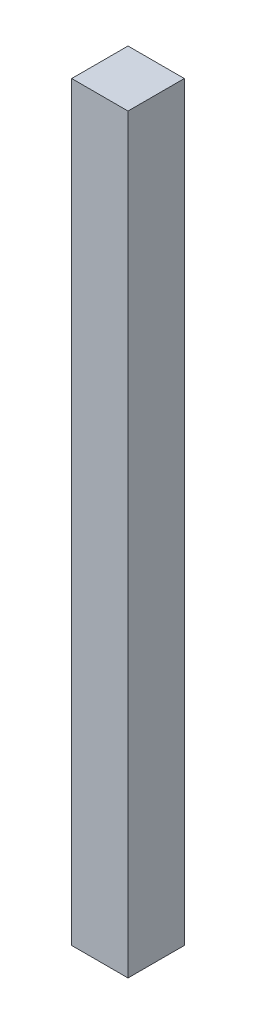
ISO-10303-21;
HEADER;
FILE_DESCRIPTION(('STEP AP214'),'2;1');
FILE_NAME('part.step','',(''),(''),'','','');
FILE_SCHEMA(('AUTOMOTIVE_DESIGN { 1 0 10303 214 1 1 1 1 }'));
ENDSEC;
DATA;
#1=APPLICATION_CONTEXT('core data for automotive mechanical design processes');
#2=APPLICATION_PROTOCOL_DEFINITION('international standard','automotive_design',2000,#1);
#3=PRODUCT_CONTEXT('',#1,'mechanical');
#4=PRODUCT('Part','Part','',(#3));
#5=PRODUCT_RELATED_PRODUCT_CATEGORY('part','',(#4));
#6=PRODUCT_DEFINITION_FORMATION('','',#4);
#7=PRODUCT_DEFINITION_CONTEXT('part definition',#1,'design');
#8=PRODUCT_DEFINITION('design','',#6,#7);
#9=PRODUCT_DEFINITION_SHAPE('','',#8);
#10=(LENGTH_UNIT() NAMED_UNIT(*) SI_UNIT(.MILLI.,.METRE.));
#11=(NAMED_UNIT(*) PLANE_ANGLE_UNIT() SI_UNIT($,.RADIAN.));
#12=(NAMED_UNIT(*) SI_UNIT($,.STERADIAN.) SOLID_ANGLE_UNIT());
#13=UNCERTAINTY_MEASURE_WITH_UNIT(LENGTH_MEASURE(1.E-05),#10,'distance_accuracy_value','');
#14=(GEOMETRIC_REPRESENTATION_CONTEXT(3) GLOBAL_UNCERTAINTY_ASSIGNED_CONTEXT((#13)) GLOBAL_UNIT_ASSIGNED_CONTEXT((#10,
#11,#12)) REPRESENTATION_CONTEXT('',''));
#15=CARTESIAN_POINT('',(0.,0.,0.));
#16=DIRECTION('',(0.,0.,1.));
#17=DIRECTION('',(1.,0.,0.));
#18=AXIS2_PLACEMENT_3D('',#15,#16,#17);
#19=CARTESIAN_POINT('',(-7.5,100.,7.5));
#20=DIRECTION('',(1.,0.,0.));
#21=DIRECTION('',(0.,0.,-1.));
#22=AXIS2_PLACEMENT_3D('',#19,#20,#21);
#23=PLANE('',#22);
#24=DIRECTION('',(0.,0.,1.));
#25=VECTOR('',#24,1.);
#26=CARTESIAN_POINT('',(-7.5,-100.,7.5));
#27=LINE('',#26,#25);
#28=CARTESIAN_POINT('',(-7.5,-100.,-7.5));
#29=VERTEX_POINT('',#28);
#30=CARTESIAN_POINT('',(-7.5,-100.,7.5));
#31=VERTEX_POINT('',#30);
#32=EDGE_CURVE('E96',#29,#31,#27,.T.);
#33=ORIENTED_EDGE('',*,*,#32,.T.);
#34=DIRECTION('',(0.,-1.,0.));
#35=VECTOR('',#34,1.);
#36=CARTESIAN_POINT('',(-7.5,100.,7.5));
#37=LINE('',#36,#35);
#38=CARTESIAN_POINT('',(-7.5,100.,7.5));
#39=VERTEX_POINT('',#38);
#40=EDGE_CURVE('E11',#39,#31,#37,.T.);
#41=ORIENTED_EDGE('',*,*,#40,.F.);
#42=DIRECTION('',(0.,0.,1.));
#43=VECTOR('',#42,1.);
#44=CARTESIAN_POINT('',(-7.5,100.,7.5));
#45=LINE('',#44,#43);
#46=CARTESIAN_POINT('',(-7.5,100.,-7.5));
#47=VERTEX_POINT('',#46);
#48=EDGE_CURVE('E84',#47,#39,#45,.T.);
#49=ORIENTED_EDGE('',*,*,#48,.F.);
#50=DIRECTION('',(0.,-1.,0.));
#51=VECTOR('',#50,1.);
#52=CARTESIAN_POINT('',(-7.5,100.,-7.5));
#53=LINE('',#52,#51);
#54=EDGE_CURVE('E92',#47,#29,#53,.T.);
#55=ORIENTED_EDGE('',*,*,#54,.T.);
#56=EDGE_LOOP('',(#33,#41,#49,#55));
#57=FACE_BOUND('',#56,.T.);
#58=ADVANCED_FACE('F33',(#57),#23,.F.);
#59=CARTESIAN_POINT('',(7.5,100.,7.5));
#60=DIRECTION('',(0.,0.,-1.));
#61=DIRECTION('',(-1.,0.,0.));
#62=AXIS2_PLACEMENT_3D('',#59,#60,#61);
#63=PLANE('',#62);
#64=DIRECTION('',(1.,0.,0.));
#65=VECTOR('',#64,1.);
#66=CARTESIAN_POINT('',(7.5,-100.,7.5));
#67=LINE('',#66,#65);
#68=CARTESIAN_POINT('',(7.5,-100.,7.5));
#69=VERTEX_POINT('',#68);
#70=EDGE_CURVE('E88',#31,#69,#67,.T.);
#71=ORIENTED_EDGE('',*,*,#70,.T.);
#72=DIRECTION('',(0.,-1.,0.));
#73=VECTOR('',#72,1.);
#74=CARTESIAN_POINT('',(7.5,100.,7.5));
#75=LINE('',#74,#73);
#76=CARTESIAN_POINT('',(7.5,100.,7.5));
#77=VERTEX_POINT('',#76);
#78=EDGE_CURVE('E41',#77,#69,#75,.T.);
#79=ORIENTED_EDGE('',*,*,#78,.F.);
#80=DIRECTION('',(1.,0.,0.));
#81=VECTOR('',#80,1.);
#82=CARTESIAN_POINT('',(7.5,100.,7.5));
#83=LINE('',#82,#81);
#84=EDGE_CURVE('E79',#39,#77,#83,.T.);
#85=ORIENTED_EDGE('',*,*,#84,.F.);
#86=ORIENTED_EDGE('',*,*,#40,.T.);
#87=EDGE_LOOP('',(#71,#79,#85,#86));
#88=FACE_BOUND('',#87,.T.);
#89=ADVANCED_FACE('F87',(#88),#63,.F.);
#90=CARTESIAN_POINT('',(7.5,100.,7.5));
#91=DIRECTION('',(-1.,0.,0.));
#92=DIRECTION('',(0.,0.,1.));
#93=AXIS2_PLACEMENT_3D('',#90,#91,#92);
#94=PLANE('',#93);
#95=DIRECTION('',(0.,0.,-1.));
#96=VECTOR('',#95,1.);
#97=CARTESIAN_POINT('',(7.5,-100.,7.5));
#98=LINE('',#97,#96);
#99=CARTESIAN_POINT('',(7.5,-100.,-7.5));
#100=VERTEX_POINT('',#99);
#101=EDGE_CURVE('E66',#69,#100,#98,.T.);
#102=ORIENTED_EDGE('',*,*,#101,.T.);
#103=DIRECTION('',(0.,-1.,0.));
#104=VECTOR('',#103,1.);
#105=CARTESIAN_POINT('',(7.5,100.,-7.5));
#106=LINE('',#105,#104);
#107=CARTESIAN_POINT('',(7.5,100.,-7.5));
#108=VERTEX_POINT('',#107);
#109=EDGE_CURVE('E89',#108,#100,#106,.T.);
#110=ORIENTED_EDGE('',*,*,#109,.F.);
#111=DIRECTION('',(0.,0.,-1.));
#112=VECTOR('',#111,1.);
#113=CARTESIAN_POINT('',(7.5,100.,7.5));
#114=LINE('',#113,#112);
#115=EDGE_CURVE('E82',#77,#108,#114,.T.);
#116=ORIENTED_EDGE('',*,*,#115,.F.);
#117=ORIENTED_EDGE('',*,*,#78,.T.);
#118=EDGE_LOOP('',(#102,#110,#116,#117));
#119=FACE_BOUND('',#118,.T.);
#120=ADVANCED_FACE('F90',(#119),#94,.F.);
#121=CARTESIAN_POINT('',(7.5,100.,-7.5));
#122=DIRECTION('',(0.,0.,1.));
#123=DIRECTION('',(1.,0.,0.));
#124=AXIS2_PLACEMENT_3D('',#121,#122,#123);
#125=PLANE('',#124);
#126=DIRECTION('',(-1.,0.,0.));
#127=VECTOR('',#126,1.);
#128=CARTESIAN_POINT('',(7.5,-100.,-7.5));
#129=LINE('',#128,#127);
#130=EDGE_CURVE('E72',#100,#29,#129,.T.);
#131=ORIENTED_EDGE('',*,*,#130,.T.);
#132=ORIENTED_EDGE('',*,*,#54,.F.);
#133=DIRECTION('',(-1.,0.,0.));
#134=VECTOR('',#133,1.);
#135=CARTESIAN_POINT('',(7.5,100.,-7.5));
#136=LINE('',#135,#134);
#137=EDGE_CURVE('E49',#108,#47,#136,.T.);
#138=ORIENTED_EDGE('',*,*,#137,.F.);
#139=ORIENTED_EDGE('',*,*,#109,.T.);
#140=EDGE_LOOP('',(#131,#132,#138,#139));
#141=FACE_BOUND('',#140,.T.);
#142=ADVANCED_FACE('F103',(#141),#125,.F.);
#143=CARTESIAN_POINT('',(0.,100.,0.));
#144=DIRECTION('',(0.,1.,0.));
#145=DIRECTION('',(0.,0.,1.));
#146=AXIS2_PLACEMENT_3D('',#143,#144,#145);
#147=PLANE('',#146);
#148=ORIENTED_EDGE('',*,*,#48,.T.);
#149=ORIENTED_EDGE('',*,*,#84,.T.);
#150=ORIENTED_EDGE('',*,*,#115,.T.);
#151=ORIENTED_EDGE('',*,*,#137,.T.);
#152=EDGE_LOOP('',(#148,#149,#150,#151));
#153=FACE_BOUND('',#152,.T.);
#154=ADVANCED_FACE('F80',(#153),#147,.T.);
#155=CARTESIAN_POINT('',(0.,-100.,0.));
#156=DIRECTION('',(0.,1.,0.));
#157=DIRECTION('',(0.,0.,1.));
#158=AXIS2_PLACEMENT_3D('',#155,#156,#157);
#159=PLANE('',#158);
#160=ORIENTED_EDGE('',*,*,#32,.F.);
#161=ORIENTED_EDGE('',*,*,#130,.F.);
#162=ORIENTED_EDGE('',*,*,#101,.F.);
#163=ORIENTED_EDGE('',*,*,#70,.F.);
#164=EDGE_LOOP('',(#160,#161,#162,#163));
#165=FACE_BOUND('',#164,.T.);
#166=ADVANCED_FACE('F106',(#165),#159,.F.);
#167=CLOSED_SHELL('',(#58,#89,#120,#142,#154,#166));
#168=MANIFOLD_SOLID_BREP('B2',#167);
#169=ADVANCED_BREP_SHAPE_REPRESENTATION('',(#18,#168),#14);
#170=SHAPE_DEFINITION_REPRESENTATION(#9,#169);
ENDSEC;
END-ISO-10303-21;
